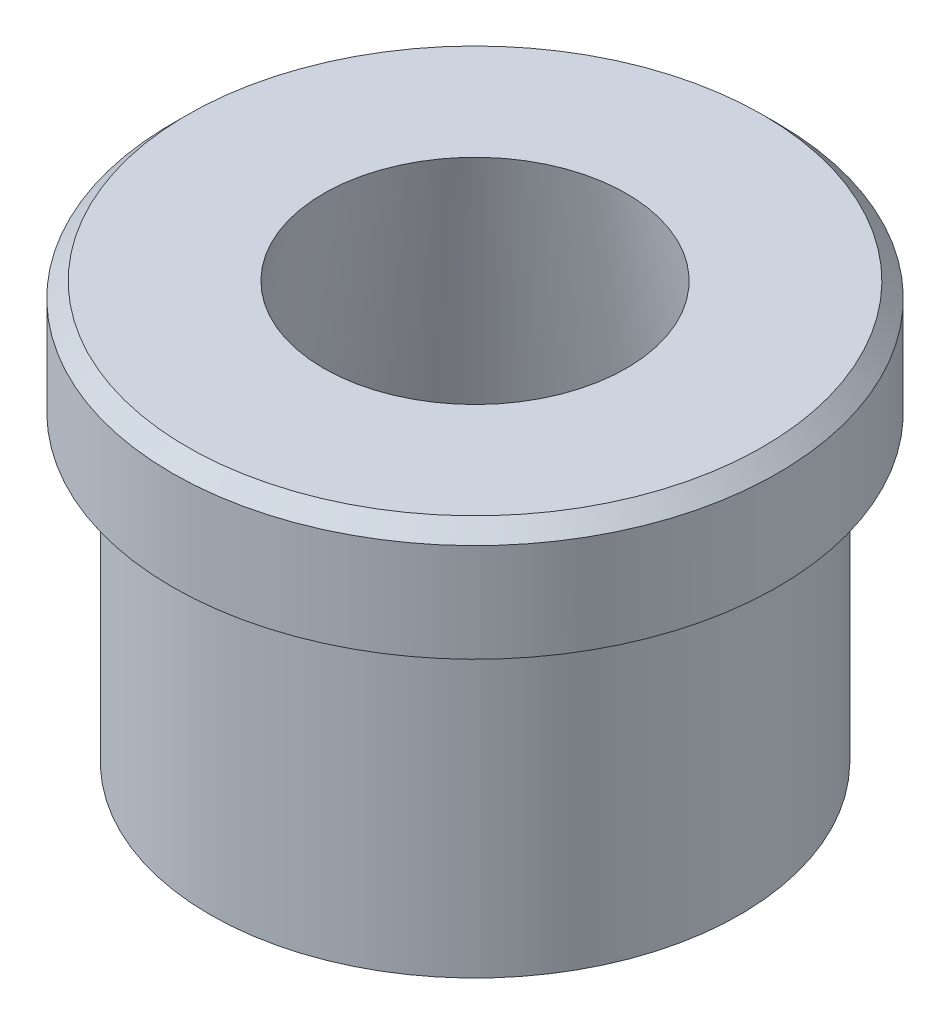
ISO-10303-21;
HEADER;
FILE_DESCRIPTION(('STEP AP214'),'2;1');
FILE_NAME('part.step','',(''),(''),'','','');
FILE_SCHEMA(('AUTOMOTIVE_DESIGN { 1 0 10303 214 1 1 1 1 }'));
ENDSEC;
DATA;
#1=APPLICATION_CONTEXT('core data for automotive mechanical design processes');
#2=APPLICATION_PROTOCOL_DEFINITION('international standard','automotive_design',2000,#1);
#3=PRODUCT_CONTEXT('',#1,'mechanical');
#4=PRODUCT('Part','Part','',(#3));
#5=PRODUCT_RELATED_PRODUCT_CATEGORY('part','',(#4));
#6=PRODUCT_DEFINITION_FORMATION('','',#4);
#7=PRODUCT_DEFINITION_CONTEXT('part definition',#1,'design');
#8=PRODUCT_DEFINITION('design','',#6,#7);
#9=PRODUCT_DEFINITION_SHAPE('','',#8);
#10=(LENGTH_UNIT() NAMED_UNIT(*) SI_UNIT(.MILLI.,.METRE.));
#11=(NAMED_UNIT(*) PLANE_ANGLE_UNIT() SI_UNIT($,.RADIAN.));
#12=(NAMED_UNIT(*) SI_UNIT($,.STERADIAN.) SOLID_ANGLE_UNIT());
#13=UNCERTAINTY_MEASURE_WITH_UNIT(LENGTH_MEASURE(1.E-05),#10,'distance_accuracy_value','');
#14=(GEOMETRIC_REPRESENTATION_CONTEXT(3) GLOBAL_UNCERTAINTY_ASSIGNED_CONTEXT((#13)) GLOBAL_UNIT_ASSIGNED_CONTEXT((#10,
#11,#12)) REPRESENTATION_CONTEXT('',''));
#15=CARTESIAN_POINT('',(0.,0.,0.));
#16=DIRECTION('',(0.,0.,1.));
#17=DIRECTION('',(1.,0.,0.));
#18=AXIS2_PLACEMENT_3D('',#15,#16,#17);
#19=CARTESIAN_POINT('',(0.,0.,0.));
#20=DIRECTION('',(0.,-1.,0.));
#21=DIRECTION('',(0.,0.,-1.));
#22=AXIS2_PLACEMENT_3D('',#19,#20,#21);
#23=CONICAL_SURFACE('',#22,3.,0.179853499792478);
#24=CARTESIAN_POINT('',(0.,0.19677398201998,0.));
#25=DIRECTION('',(0.,1.,0.));
#26=DIRECTION('',(0.,0.,1.));
#27=AXIS2_PLACEMENT_3D('',#24,#25,#26);
#28=CIRCLE('',#27,2.96422291236);
#29=CARTESIAN_POINT('',(0.,0.19677398201998,2.96422291236));
#30=VERTEX_POINT('',#29);
#31=EDGE_CURVE('E41',#30,#30,#28,.F.);
#32=ORIENTED_EDGE('',*,*,#31,.T.);
#33=EDGE_LOOP('',(#32));
#34=FACE_BOUND('',#33,.T.);
#35=CARTESIAN_POINT('',(0.,5.5,0.));
#36=DIRECTION('',(0.,1.,0.));
#37=DIRECTION('',(0.,0.,1.));
#38=AXIS2_PLACEMENT_3D('',#35,#36,#37);
#39=CIRCLE('',#38,2.);
#40=CARTESIAN_POINT('',(0.,5.5,2.));
#41=VERTEX_POINT('',#40);
#42=EDGE_CURVE('E59',#41,#41,#39,.T.);
#43=ORIENTED_EDGE('',*,*,#42,.T.);
#44=EDGE_LOOP('',(#43));
#45=FACE_BOUND('',#44,.T.);
#46=ADVANCED_FACE('F30',(#34,#45),#23,.F.);
#47=CARTESIAN_POINT('',(-3.,0.,0.));
#48=DIRECTION('',(0.,-1.,0.));
#49=DIRECTION('',(0.,0.,-1.));
#50=AXIS2_PLACEMENT_3D('',#47,#48,#49);
#51=PLANE('',#50);
#52=CARTESIAN_POINT('',(0.,0.,0.));
#53=DIRECTION('',(0.,-1.,0.));
#54=DIRECTION('',(0.,0.,-1.));
#55=AXIS2_PLACEMENT_3D('',#52,#53,#54);
#56=CIRCLE('',#55,3.24845199749997);
#57=CARTESIAN_POINT('',(0.,0.,-3.24845199749997));
#58=VERTEX_POINT('',#57);
#59=EDGE_CURVE('E45',#58,#58,#56,.F.);
#60=ORIENTED_EDGE('',*,*,#59,.T.);
#61=EDGE_LOOP('',(#60));
#62=FACE_BOUND('',#61,.T.);
#63=CARTESIAN_POINT('',(0.,0.,0.));
#64=DIRECTION('',(0.,1.,0.));
#65=DIRECTION('',(0.,0.,1.));
#66=AXIS2_PLACEMENT_3D('',#63,#64,#65);
#67=CIRCLE('',#66,3.5);
#68=CARTESIAN_POINT('',(0.,0.,3.5));
#69=VERTEX_POINT('',#68);
#70=EDGE_CURVE('E50',#69,#69,#67,.T.);
#71=ORIENTED_EDGE('',*,*,#70,.F.);
#72=EDGE_LOOP('',(#71));
#73=FACE_BOUND('',#72,.T.);
#74=ADVANCED_FACE('F77',(#62,#73),#51,.T.);
#75=CARTESIAN_POINT('',(0.,5.5,0.));
#76=DIRECTION('',(0.,1.,0.));
#77=DIRECTION('',(0.,0.,1.));
#78=AXIS2_PLACEMENT_3D('',#75,#76,#77);
#79=CYLINDRICAL_SURFACE('',#78,3.5);
#80=ORIENTED_EDGE('',*,*,#70,.T.);
#81=EDGE_LOOP('',(#80));
#82=FACE_BOUND('',#81,.T.);
#83=CARTESIAN_POINT('',(0.,4.,0.));
#84=DIRECTION('',(0.,1.,0.));
#85=DIRECTION('',(0.,0.,1.));
#86=AXIS2_PLACEMENT_3D('',#83,#84,#85);
#87=CIRCLE('',#86,3.5);
#88=CARTESIAN_POINT('',(0.,4.,3.5));
#89=VERTEX_POINT('',#88);
#90=EDGE_CURVE('E53',#89,#89,#87,.T.);
#91=ORIENTED_EDGE('',*,*,#90,.F.);
#92=EDGE_LOOP('',(#91));
#93=FACE_BOUND('',#92,.T.);
#94=ADVANCED_FACE('F83',(#82,#93),#79,.T.);
#95=CARTESIAN_POINT('',(-3.5,4.,0.));
#96=DIRECTION('',(0.,-1.,0.));
#97=DIRECTION('',(0.,0.,-1.));
#98=AXIS2_PLACEMENT_3D('',#95,#96,#97);
#99=PLANE('',#98);
#100=ORIENTED_EDGE('',*,*,#90,.T.);
#101=EDGE_LOOP('',(#100));
#102=FACE_BOUND('',#101,.T.);
#103=CARTESIAN_POINT('',(0.,4.,0.));
#104=DIRECTION('',(0.,1.,0.));
#105=DIRECTION('',(0.,0.,1.));
#106=AXIS2_PLACEMENT_3D('',#103,#104,#105);
#107=CIRCLE('',#106,4.);
#108=CARTESIAN_POINT('',(0.,4.,4.));
#109=VERTEX_POINT('',#108);
#110=EDGE_CURVE('E56',#109,#109,#107,.T.);
#111=ORIENTED_EDGE('',*,*,#110,.F.);
#112=EDGE_LOOP('',(#111));
#113=FACE_BOUND('',#112,.T.);
#114=ADVANCED_FACE('F74',(#102,#113),#99,.T.);
#115=CARTESIAN_POINT('',(0.,5.5,0.));
#116=DIRECTION('',(0.,1.,0.));
#117=DIRECTION('',(0.,0.,1.));
#118=AXIS2_PLACEMENT_3D('',#115,#116,#117);
#119=CYLINDRICAL_SURFACE('',#118,4.);
#120=CARTESIAN_POINT('',(0.,5.3,0.));
#121=DIRECTION('',(0.,1.,0.));
#122=DIRECTION('',(0.,0.,1.));
#123=AXIS2_PLACEMENT_3D('',#120,#121,#122);
#124=CIRCLE('',#123,4.);
#125=CARTESIAN_POINT('',(0.,5.3,-4.));
#126=VERTEX_POINT('',#125);
#127=EDGE_CURVE('E10',#126,#126,#124,.F.);
#128=ORIENTED_EDGE('',*,*,#127,.T.);
#129=EDGE_LOOP('',(#128));
#130=FACE_BOUND('',#129,.T.);
#131=ORIENTED_EDGE('',*,*,#110,.T.);
#132=EDGE_LOOP('',(#131));
#133=FACE_BOUND('',#132,.T.);
#134=ADVANCED_FACE('F67',(#130,#133),#119,.T.);
#135=CARTESIAN_POINT('',(-4.,5.5,0.));
#136=DIRECTION('',(0.,1.,0.));
#137=DIRECTION('',(0.,0.,1.));
#138=AXIS2_PLACEMENT_3D('',#135,#136,#137);
#139=PLANE('',#138);
#140=CARTESIAN_POINT('',(0.,5.5,0.));
#141=DIRECTION('',(0.,1.,0.));
#142=DIRECTION('',(0.,0.,1.));
#143=AXIS2_PLACEMENT_3D('',#140,#141,#142);
#144=CIRCLE('',#143,3.8);
#145=CARTESIAN_POINT('',(0.,5.5,-3.8));
#146=VERTEX_POINT('',#145);
#147=EDGE_CURVE('E37',#146,#146,#144,.T.);
#148=ORIENTED_EDGE('',*,*,#147,.T.);
#149=EDGE_LOOP('',(#148));
#150=FACE_BOUND('',#149,.T.);
#151=ORIENTED_EDGE('',*,*,#42,.F.);
#152=EDGE_LOOP('',(#151));
#153=FACE_BOUND('',#152,.T.);
#154=ADVANCED_FACE('F64',(#150,#153),#139,.T.);
#155=CARTESIAN_POINT('',(0.,0.,0.));
#156=DIRECTION('',(0.,-1.,0.));
#157=DIRECTION('',(0.,0.,-1.));
#158=AXIS2_PLACEMENT_3D('',#155,#156,#157);
#159=CONICAL_SURFACE('',#158,3.24845199749997,0.965251663189925);
#160=ORIENTED_EDGE('',*,*,#31,.F.);
#161=EDGE_LOOP('',(#160));
#162=FACE_BOUND('',#161,.T.);
#163=ORIENTED_EDGE('',*,*,#59,.F.);
#164=EDGE_LOOP('',(#163));
#165=FACE_BOUND('',#164,.T.);
#166=ADVANCED_FACE('F66',(#162,#165),#159,.F.);
#167=CARTESIAN_POINT('',(0.,5.5,0.));
#168=DIRECTION('',(0.,-1.,0.));
#169=DIRECTION('',(0.,0.,-1.));
#170=AXIS2_PLACEMENT_3D('',#167,#168,#169);
#171=CONICAL_SURFACE('',#170,3.8,0.78539816339745);
#172=CARTESIAN_POINT('',(0.,5.3,-4.));
#173=CARTESIAN_POINT('',(0.,5.30208333333333,-3.99791666666667));
#174=CARTESIAN_POINT('',(0.,5.30416666666667,-3.99583333333333));
#175=CARTESIAN_POINT('',(0.,5.30833333333333,-3.99166666666667));
#176=CARTESIAN_POINT('',(0.,5.31041666666667,-3.98958333333333));
#177=CARTESIAN_POINT('',(0.,5.31458333333333,-3.98541666666667));
#178=CARTESIAN_POINT('',(0.,5.31666666666667,-3.98333333333333));
#179=CARTESIAN_POINT('',(0.,5.32083333333333,-3.97916666666667));
#180=CARTESIAN_POINT('',(0.,5.32291666666667,-3.97708333333333));
#181=CARTESIAN_POINT('',(0.,5.32708333333333,-3.97291666666667));
#182=CARTESIAN_POINT('',(0.,5.32916666666667,-3.97083333333333));
#183=CARTESIAN_POINT('',(0.,5.33333333333333,-3.96666666666667));
#184=CARTESIAN_POINT('',(0.,5.33541666666667,-3.96458333333333));
#185=CARTESIAN_POINT('',(0.,5.33958333333333,-3.96041666666667));
#186=CARTESIAN_POINT('',(0.,5.34166666666667,-3.95833333333333));
#187=CARTESIAN_POINT('',(0.,5.34583333333333,-3.95416666666667));
#188=CARTESIAN_POINT('',(0.,5.34791666666667,-3.95208333333333));
#189=CARTESIAN_POINT('',(0.,5.35208333333333,-3.94791666666667));
#190=CARTESIAN_POINT('',(0.,5.35416666666667,-3.94583333333333));
#191=CARTESIAN_POINT('',(0.,5.35833333333333,-3.94166666666667));
#192=CARTESIAN_POINT('',(0.,5.36041666666667,-3.93958333333333));
#193=CARTESIAN_POINT('',(0.,5.36458333333333,-3.93541666666667));
#194=CARTESIAN_POINT('',(0.,5.36666666666667,-3.93333333333333));
#195=CARTESIAN_POINT('',(0.,5.37083333333333,-3.92916666666667));
#196=CARTESIAN_POINT('',(0.,5.37291666666667,-3.92708333333333));
#197=CARTESIAN_POINT('',(0.,5.37708333333333,-3.92291666666667));
#198=CARTESIAN_POINT('',(0.,5.37916666666667,-3.92083333333333));
#199=CARTESIAN_POINT('',(0.,5.38333333333333,-3.91666666666667));
#200=CARTESIAN_POINT('',(0.,5.38541666666667,-3.91458333333333));
#201=CARTESIAN_POINT('',(0.,5.38958333333333,-3.91041666666667));
#202=CARTESIAN_POINT('',(0.,5.39166666666667,-3.90833333333333));
#203=CARTESIAN_POINT('',(0.,5.39583333333333,-3.90416666666667));
#204=CARTESIAN_POINT('',(0.,5.39791666666667,-3.90208333333333));
#205=CARTESIAN_POINT('',(0.,5.40208333333333,-3.89791666666667));
#206=CARTESIAN_POINT('',(0.,5.40416666666667,-3.89583333333333));
#207=CARTESIAN_POINT('',(0.,5.40833333333333,-3.89166666666667));
#208=CARTESIAN_POINT('',(0.,5.41041666666667,-3.88958333333333));
#209=CARTESIAN_POINT('',(0.,5.41458333333333,-3.88541666666667));
#210=CARTESIAN_POINT('',(0.,5.41666666666667,-3.88333333333333));
#211=CARTESIAN_POINT('',(0.,5.42083333333333,-3.87916666666667));
#212=CARTESIAN_POINT('',(0.,5.42291666666667,-3.87708333333333));
#213=CARTESIAN_POINT('',(0.,5.42708333333333,-3.87291666666667));
#214=CARTESIAN_POINT('',(0.,5.42916666666667,-3.87083333333333));
#215=CARTESIAN_POINT('',(0.,5.43333333333333,-3.86666666666667));
#216=CARTESIAN_POINT('',(0.,5.43541666666667,-3.86458333333333));
#217=CARTESIAN_POINT('',(0.,5.43958333333333,-3.86041666666667));
#218=CARTESIAN_POINT('',(0.,5.44166666666667,-3.85833333333333));
#219=CARTESIAN_POINT('',(0.,5.44583333333333,-3.85416666666667));
#220=CARTESIAN_POINT('',(0.,5.44791666666667,-3.85208333333333));
#221=CARTESIAN_POINT('',(0.,5.45208333333333,-3.84791666666667));
#222=CARTESIAN_POINT('',(0.,5.45416666666667,-3.84583333333333));
#223=CARTESIAN_POINT('',(0.,5.45833333333333,-3.84166666666667));
#224=CARTESIAN_POINT('',(0.,5.46041666666667,-3.83958333333333));
#225=CARTESIAN_POINT('',(0.,5.46458333333333,-3.83541666666667));
#226=CARTESIAN_POINT('',(0.,5.46666666666667,-3.83333333333333));
#227=CARTESIAN_POINT('',(0.,5.47083333333333,-3.82916666666667));
#228=CARTESIAN_POINT('',(0.,5.47291666666667,-3.82708333333333));
#229=CARTESIAN_POINT('',(0.,5.47708333333333,-3.82291666666667));
#230=CARTESIAN_POINT('',(0.,5.47916666666667,-3.82083333333333));
#231=CARTESIAN_POINT('',(0.,5.48333333333333,-3.81666666666667));
#232=CARTESIAN_POINT('',(0.,5.48541666666667,-3.81458333333333));
#233=CARTESIAN_POINT('',(0.,5.48958333333333,-3.81041666666667));
#234=CARTESIAN_POINT('',(0.,5.49166666666667,-3.80833333333333));
#235=CARTESIAN_POINT('',(0.,5.49583333333333,-3.80416666666667));
#236=CARTESIAN_POINT('',(0.,5.49791666666667,-3.80208333333333));
#237=CARTESIAN_POINT('',(0.,5.5,-3.8));
#238=B_SPLINE_CURVE_WITH_KNOTS('',3,(#172,#173,#174,#175,#176,#177,#178,#179,#180,#181,#182,
#183,#184,#185,#186,#187,#188,#189,#190,#191,#192,#193,#194,#195,#196,#197,#198,#199,#200,#201,
#202,#203,#204,#205,#206,#207,#208,#209,#210,#211,#212,#213,#214,#215,#216,#217,#218,#219,#220,
#221,#222,#223,#224,#225,#226,#227,#228,#229,#230,#231,#232,#233,#234,#235,#236,#237),
.UNSPECIFIED.,.F.,.F.,(4,2,2,2,2,2,2,2,2,2,2,2,2,2,2,2,2,2,2,2,2,2,2,2,2,2,2,2,2,2,2,2,4),(0.,
0.00883883476483087,0.017677669529663,0.0265165042944951,0.0353553390593272,0.0441941738241586,
0.0530330085889901,0.0618718433538222,0.0707106781186543,0.0795495128834864,0.0883883476483179,
0.0972271824131494,0.106066017177981,0.114904851942814,0.123743686707645,0.132582521472477,
0.141421356237309,0.150260191002141,0.159099025766973,0.167937860531804,0.176776695296636,
0.185615530061468,0.1944543648263,0.203293199591132,0.212132034355964,0.220970869120796,
0.229809703885628,0.23864853865046,0.247487373415291,0.256326208180123,0.265165042944955,
0.274003877709787,0.282842712474619),.UNSPECIFIED.);
#239=EDGE_CURVE('BSEAM32',#126,#146,#238,.T.);
#240=ORIENTED_EDGE('',*,*,#127,.F.);
#241=ORIENTED_EDGE('',*,*,#147,.F.);
#242=ORIENTED_EDGE('',*,*,#239,.T.);
#243=ORIENTED_EDGE('',*,*,#239,.F.);
#244=EDGE_LOOP('',(#240,#242,#241,#243));
#245=FACE_BOUND('',#244,.T.);
#246=ADVANCED_FACE('F32',(#245),#171,.T.);
#247=CLOSED_SHELL('',(#46,#74,#94,#114,#134,#154,#166,#246));
#248=MANIFOLD_SOLID_BREP('B2',#247);
#249=ADVANCED_BREP_SHAPE_REPRESENTATION('',(#18,#248),#14);
#250=SHAPE_DEFINITION_REPRESENTATION(#9,#249);
ENDSEC;
END-ISO-10303-21;
